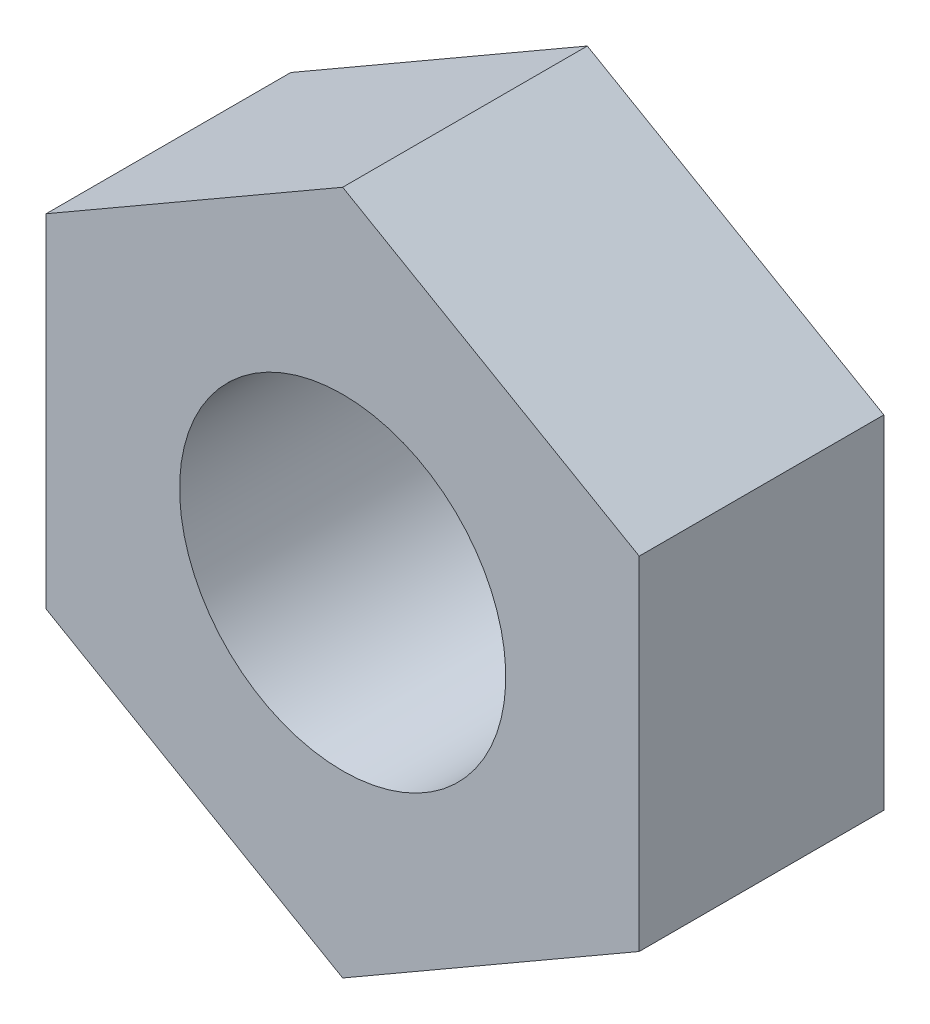
ISO-10303-21;
HEADER;
FILE_DESCRIPTION(('STEP AP214'),'2;1');
FILE_NAME('part.step','',(''),(''),'','','');
FILE_SCHEMA(('AUTOMOTIVE_DESIGN { 1 0 10303 214 1 1 1 1 }'));
ENDSEC;
DATA;
#1=APPLICATION_CONTEXT('core data for automotive mechanical design processes');
#2=APPLICATION_PROTOCOL_DEFINITION('international standard','automotive_design',2000,#1);
#3=PRODUCT_CONTEXT('',#1,'mechanical');
#4=PRODUCT('Part','Part','',(#3));
#5=PRODUCT_RELATED_PRODUCT_CATEGORY('part','',(#4));
#6=PRODUCT_DEFINITION_FORMATION('','',#4);
#7=PRODUCT_DEFINITION_CONTEXT('part definition',#1,'design');
#8=PRODUCT_DEFINITION('design','',#6,#7);
#9=PRODUCT_DEFINITION_SHAPE('','',#8);
#10=(LENGTH_UNIT() NAMED_UNIT(*) SI_UNIT(.MILLI.,.METRE.));
#11=(NAMED_UNIT(*) PLANE_ANGLE_UNIT() SI_UNIT($,.RADIAN.));
#12=(NAMED_UNIT(*) SI_UNIT($,.STERADIAN.) SOLID_ANGLE_UNIT());
#13=UNCERTAINTY_MEASURE_WITH_UNIT(LENGTH_MEASURE(1.E-05),#10,'distance_accuracy_value','');
#14=(GEOMETRIC_REPRESENTATION_CONTEXT(3) GLOBAL_UNCERTAINTY_ASSIGNED_CONTEXT((#13)) GLOBAL_UNIT_ASSIGNED_CONTEXT((#10,
#11,#12)) REPRESENTATION_CONTEXT('',''));
#15=CARTESIAN_POINT('',(0.,0.,0.));
#16=DIRECTION('',(0.,0.,1.));
#17=DIRECTION('',(1.,0.,0.));
#18=AXIS2_PLACEMENT_3D('',#15,#16,#17);
#19=CARTESIAN_POINT('',(42.295947098363,-44.0038969989796,205.592271057495));
#20=DIRECTION('',(1.,0.,0.));
#21=DIRECTION('',(0.,0.,1.));
#22=AXIS2_PLACEMENT_3D('',#19,#20,#21);
#23=PLANE('',#22);
#24=DIRECTION('',(0.,-1.,0.));
#25=VECTOR('',#24,1.);
#26=CARTESIAN_POINT('',(42.295947098363,-44.0038969989796,202.292271057495));
#27=LINE('',#26,#25);
#28=CARTESIAN_POINT('',(42.295947098363,-44.0038969989796,202.292271057495));
#29=VERTEX_POINT('',#28);
#30=CARTESIAN_POINT('',(42.295947098363,-48.6226991524966,202.292271057495));
#31=VERTEX_POINT('',#30);
#32=EDGE_CURVE('E11',#29,#31,#27,.T.);
#33=ORIENTED_EDGE('',*,*,#32,.T.);
#34=DIRECTION('',(0.,0.,-1.));
#35=VECTOR('',#34,1.);
#36=CARTESIAN_POINT('',(42.295947098363,-48.6226991524966,205.592271057495));
#37=LINE('',#36,#35);
#38=CARTESIAN_POINT('',(42.295947098363,-48.6226991524966,205.592271057495));
#39=VERTEX_POINT('',#38);
#40=EDGE_CURVE('E36',#39,#31,#37,.T.);
#41=ORIENTED_EDGE('',*,*,#40,.F.);
#42=DIRECTION('',(0.,-1.,0.));
#43=VECTOR('',#42,1.);
#44=CARTESIAN_POINT('',(42.295947098363,-44.0038969989796,205.592271057495));
#45=LINE('',#44,#43);
#46=CARTESIAN_POINT('',(42.295947098363,-44.0038969989796,205.592271057495));
#47=VERTEX_POINT('',#46);
#48=EDGE_CURVE('E89',#47,#39,#45,.T.);
#49=ORIENTED_EDGE('',*,*,#48,.F.);
#50=DIRECTION('',(0.,0.,-1.));
#51=VECTOR('',#50,1.);
#52=CARTESIAN_POINT('',(42.295947098363,-44.0038969989796,205.592271057495));
#53=LINE('',#52,#51);
#54=EDGE_CURVE('E27',#47,#29,#53,.T.);
#55=ORIENTED_EDGE('',*,*,#54,.T.);
#56=EDGE_LOOP('',(#33,#41,#49,#55));
#57=FACE_BOUND('',#56,.T.);
#58=ADVANCED_FACE('F17',(#57),#23,.F.);
#59=CARTESIAN_POINT('',(42.295947098363,-48.6226991524966,205.592271057495));
#60=DIRECTION('',(0.5,0.866025403784438,0.));
#61=DIRECTION('',(-0.866025403784438,0.5,0.));
#62=AXIS2_PLACEMENT_3D('',#59,#60,#61);
#63=PLANE('',#62);
#64=DIRECTION('',(0.866025403784439,-0.5,0.));
#65=VECTOR('',#64,1.);
#66=CARTESIAN_POINT('',(42.295947098363,-48.6226991524966,202.292271057495));
#67=LINE('',#66,#65);
#68=CARTESIAN_POINT('',(46.295947098363,-50.9321002292552,202.292271057495));
#69=VERTEX_POINT('',#68);
#70=EDGE_CURVE('E100',#31,#69,#67,.T.);
#71=ORIENTED_EDGE('',*,*,#70,.T.);
#72=DIRECTION('',(0.,0.,-1.));
#73=VECTOR('',#72,1.);
#74=CARTESIAN_POINT('',(46.295947098363,-50.9321002292552,205.592271057495));
#75=LINE('',#74,#73);
#76=CARTESIAN_POINT('',(46.295947098363,-50.9321002292552,205.592271057495));
#77=VERTEX_POINT('',#76);
#78=EDGE_CURVE('E102',#77,#69,#75,.T.);
#79=ORIENTED_EDGE('',*,*,#78,.F.);
#80=DIRECTION('',(0.866025403784439,-0.5,0.));
#81=VECTOR('',#80,1.);
#82=CARTESIAN_POINT('',(42.295947098363,-48.6226991524966,205.592271057495));
#83=LINE('',#82,#81);
#84=EDGE_CURVE('E92',#39,#77,#83,.T.);
#85=ORIENTED_EDGE('',*,*,#84,.F.);
#86=ORIENTED_EDGE('',*,*,#40,.T.);
#87=EDGE_LOOP('',(#71,#79,#85,#86));
#88=FACE_BOUND('',#87,.T.);
#89=ADVANCED_FACE('F135',(#88),#63,.F.);
#90=CARTESIAN_POINT('',(46.295947098363,-50.9321002292552,205.592271057495));
#91=DIRECTION('',(-0.5,0.866025403784439,0.));
#92=DIRECTION('',(-0.866025403784439,-0.5,0.));
#93=AXIS2_PLACEMENT_3D('',#90,#91,#92);
#94=PLANE('',#93);
#95=DIRECTION('',(0.866025403784439,0.5,0.));
#96=VECTOR('',#95,1.);
#97=CARTESIAN_POINT('',(46.295947098363,-50.9321002292552,202.292271057495));
#98=LINE('',#97,#96);
#99=CARTESIAN_POINT('',(50.295947098363,-48.6226991524967,202.292271057495));
#100=VERTEX_POINT('',#99);
#101=EDGE_CURVE('E103',#69,#100,#98,.T.);
#102=ORIENTED_EDGE('',*,*,#101,.T.);
#103=DIRECTION('',(0.,0.,-1.));
#104=VECTOR('',#103,1.);
#105=CARTESIAN_POINT('',(50.295947098363,-48.6226991524967,205.592271057495));
#106=LINE('',#105,#104);
#107=CARTESIAN_POINT('',(50.295947098363,-48.6226991524967,205.592271057495));
#108=VERTEX_POINT('',#107);
#109=EDGE_CURVE('E108',#108,#100,#106,.T.);
#110=ORIENTED_EDGE('',*,*,#109,.F.);
#111=DIRECTION('',(0.866025403784439,0.5,0.));
#112=VECTOR('',#111,1.);
#113=CARTESIAN_POINT('',(46.295947098363,-50.9321002292552,205.592271057495));
#114=LINE('',#113,#112);
#115=EDGE_CURVE('E94',#77,#108,#114,.T.);
#116=ORIENTED_EDGE('',*,*,#115,.F.);
#117=ORIENTED_EDGE('',*,*,#78,.T.);
#118=EDGE_LOOP('',(#102,#110,#116,#117));
#119=FACE_BOUND('',#118,.T.);
#120=ADVANCED_FACE('F141',(#119),#94,.F.);
#121=CARTESIAN_POINT('',(50.295947098363,-48.6226991524967,205.592271057495));
#122=DIRECTION('',(-1.,0.,0.));
#123=DIRECTION('',(0.,0.,-1.));
#124=AXIS2_PLACEMENT_3D('',#121,#122,#123);
#125=PLANE('',#124);
#126=DIRECTION('',(0.,1.,0.));
#127=VECTOR('',#126,1.);
#128=CARTESIAN_POINT('',(50.295947098363,-48.6226991524967,202.292271057495));
#129=LINE('',#128,#127);
#130=CARTESIAN_POINT('',(50.295947098363,-44.0038969989796,202.292271057495));
#131=VERTEX_POINT('',#130);
#132=EDGE_CURVE('E104',#100,#131,#129,.T.);
#133=ORIENTED_EDGE('',*,*,#132,.T.);
#134=DIRECTION('',(0.,0.,-1.));
#135=VECTOR('',#134,1.);
#136=CARTESIAN_POINT('',(50.295947098363,-44.0038969989796,205.592271057495));
#137=LINE('',#136,#135);
#138=CARTESIAN_POINT('',(50.295947098363,-44.0038969989796,205.592271057495));
#139=VERTEX_POINT('',#138);
#140=EDGE_CURVE('E114',#139,#131,#137,.T.);
#141=ORIENTED_EDGE('',*,*,#140,.F.);
#142=DIRECTION('',(0.,1.,0.));
#143=VECTOR('',#142,1.);
#144=CARTESIAN_POINT('',(50.295947098363,-48.6226991524967,205.592271057495));
#145=LINE('',#144,#143);
#146=EDGE_CURVE('E84',#108,#139,#145,.T.);
#147=ORIENTED_EDGE('',*,*,#146,.F.);
#148=ORIENTED_EDGE('',*,*,#109,.T.);
#149=EDGE_LOOP('',(#133,#141,#147,#148));
#150=FACE_BOUND('',#149,.T.);
#151=ADVANCED_FACE('F144',(#150),#125,.F.);
#152=CARTESIAN_POINT('',(50.295947098363,-44.0038969989796,205.592271057495));
#153=DIRECTION('',(-0.5,-0.866025403784438,0.));
#154=DIRECTION('',(0.866025403784438,-0.5,0.));
#155=AXIS2_PLACEMENT_3D('',#152,#153,#154);
#156=PLANE('',#155);
#157=DIRECTION('',(-0.866025403784437,0.5,0.));
#158=VECTOR('',#157,1.);
#159=CARTESIAN_POINT('',(50.295947098363,-44.0038969989796,202.292271057495));
#160=LINE('',#159,#158);
#161=CARTESIAN_POINT('',(46.295947098363,-41.6944959222212,202.292271057495));
#162=VERTEX_POINT('',#161);
#163=EDGE_CURVE('E110',#131,#162,#160,.T.);
#164=ORIENTED_EDGE('',*,*,#163,.T.);
#165=DIRECTION('',(0.,0.,-1.));
#166=VECTOR('',#165,1.);
#167=CARTESIAN_POINT('',(46.295947098363,-41.6944959222212,205.592271057495));
#168=LINE('',#167,#166);
#169=CARTESIAN_POINT('',(46.295947098363,-41.6944959222212,205.592271057495));
#170=VERTEX_POINT('',#169);
#171=EDGE_CURVE('E88',#170,#162,#168,.T.);
#172=ORIENTED_EDGE('',*,*,#171,.F.);
#173=DIRECTION('',(-0.866025403784437,0.5,0.));
#174=VECTOR('',#173,1.);
#175=CARTESIAN_POINT('',(50.295947098363,-44.0038969989796,205.592271057495));
#176=LINE('',#175,#174);
#177=EDGE_CURVE('E80',#139,#170,#176,.T.);
#178=ORIENTED_EDGE('',*,*,#177,.F.);
#179=ORIENTED_EDGE('',*,*,#140,.T.);
#180=EDGE_LOOP('',(#164,#172,#178,#179));
#181=FACE_BOUND('',#180,.T.);
#182=ADVANCED_FACE('F122',(#181),#156,.F.);
#183=CARTESIAN_POINT('',(46.295947098363,-41.6944959222212,205.592271057495));
#184=DIRECTION('',(0.5,-0.866025403784439,0.));
#185=DIRECTION('',(0.866025403784439,0.5,0.));
#186=AXIS2_PLACEMENT_3D('',#183,#184,#185);
#187=PLANE('',#186);
#188=DIRECTION('',(-0.866025403784439,-0.5,0.));
#189=VECTOR('',#188,1.);
#190=CARTESIAN_POINT('',(46.295947098363,-41.6944959222212,202.292271057495));
#191=LINE('',#190,#189);
#192=EDGE_CURVE('E87',#162,#29,#191,.T.);
#193=ORIENTED_EDGE('',*,*,#192,.T.);
#194=ORIENTED_EDGE('',*,*,#54,.F.);
#195=DIRECTION('',(-0.866025403784439,-0.5,0.));
#196=VECTOR('',#195,1.);
#197=CARTESIAN_POINT('',(46.295947098363,-41.6944959222212,205.592271057495));
#198=LINE('',#197,#196);
#199=EDGE_CURVE('E78',#170,#47,#198,.T.);
#200=ORIENTED_EDGE('',*,*,#199,.F.);
#201=ORIENTED_EDGE('',*,*,#171,.T.);
#202=EDGE_LOOP('',(#193,#194,#200,#201));
#203=FACE_BOUND('',#202,.T.);
#204=ADVANCED_FACE('F132',(#203),#187,.F.);
#205=CARTESIAN_POINT('',(46.295947098363,-46.3132980757381,205.592271057495));
#206=DIRECTION('',(0.,0.,-1.));
#207=DIRECTION('',(0.,1.,0.));
#208=AXIS2_PLACEMENT_3D('',#205,#206,#207);
#209=CYLINDRICAL_SURFACE('',#208,2.2);
#210=CARTESIAN_POINT('',(46.295947098363,-46.3132980757381,205.592271057495));
#211=DIRECTION('',(0.,0.,1.));
#212=DIRECTION('',(0.,-1.,0.));
#213=AXIS2_PLACEMENT_3D('',#210,#211,#212);
#214=CIRCLE('',#213,2.2);
#215=CARTESIAN_POINT('',(46.295947098363,-48.5132980757381,205.592271057495));
#216=VERTEX_POINT('',#215);
#217=EDGE_CURVE('E72',#216,#216,#214,.T.);
#218=ORIENTED_EDGE('',*,*,#217,.T.);
#219=EDGE_LOOP('',(#218));
#220=FACE_BOUND('',#219,.T.);
#221=CARTESIAN_POINT('',(46.295947098363,-46.3132980757381,202.292271057495));
#222=DIRECTION('',(0.,0.,1.));
#223=DIRECTION('',(0.,-1.,0.));
#224=AXIS2_PLACEMENT_3D('',#221,#222,#223);
#225=CIRCLE('',#224,2.2);
#226=CARTESIAN_POINT('',(46.295947098363,-48.5132980757381,202.292271057495));
#227=VERTEX_POINT('',#226);
#228=EDGE_CURVE('E21',#227,#227,#225,.T.);
#229=ORIENTED_EDGE('',*,*,#228,.F.);
#230=EDGE_LOOP('',(#229));
#231=FACE_BOUND('',#230,.T.);
#232=ADVANCED_FACE('F76',(#220,#231),#209,.F.);
#233=CARTESIAN_POINT('',(46.295947098363,-46.3132980757381,205.592271057495));
#234=DIRECTION('',(0.,0.,1.));
#235=DIRECTION('',(0.,-1.,0.));
#236=AXIS2_PLACEMENT_3D('',#233,#234,#235);
#237=PLANE('',#236);
#238=ORIENTED_EDGE('',*,*,#48,.T.);
#239=ORIENTED_EDGE('',*,*,#84,.T.);
#240=ORIENTED_EDGE('',*,*,#115,.T.);
#241=ORIENTED_EDGE('',*,*,#146,.T.);
#242=ORIENTED_EDGE('',*,*,#177,.T.);
#243=ORIENTED_EDGE('',*,*,#199,.T.);
#244=EDGE_LOOP('',(#238,#239,#240,#241,#242,#243));
#245=FACE_BOUND('',#244,.T.);
#246=ORIENTED_EDGE('',*,*,#217,.F.);
#247=EDGE_LOOP('',(#246));
#248=FACE_BOUND('',#247,.T.);
#249=ADVANCED_FACE('F137',(#245,#248),#237,.T.);
#250=CARTESIAN_POINT('',(46.295947098363,-46.3132980757381,202.292271057495));
#251=DIRECTION('',(0.,0.,1.));
#252=DIRECTION('',(0.,-1.,0.));
#253=AXIS2_PLACEMENT_3D('',#250,#251,#252);
#254=PLANE('',#253);
#255=ORIENTED_EDGE('',*,*,#32,.F.);
#256=ORIENTED_EDGE('',*,*,#192,.F.);
#257=ORIENTED_EDGE('',*,*,#163,.F.);
#258=ORIENTED_EDGE('',*,*,#132,.F.);
#259=ORIENTED_EDGE('',*,*,#101,.F.);
#260=ORIENTED_EDGE('',*,*,#70,.F.);
#261=EDGE_LOOP('',(#255,#256,#257,#258,#259,#260));
#262=FACE_BOUND('',#261,.T.);
#263=ORIENTED_EDGE('',*,*,#228,.T.);
#264=EDGE_LOOP('',(#263));
#265=FACE_BOUND('',#264,.T.);
#266=ADVANCED_FACE('F19',(#262,#265),#254,.F.);
#267=CLOSED_SHELL('',(#58,#89,#120,#151,#182,#204,#232,#249,#266));
#268=MANIFOLD_SOLID_BREP('B1',#267);
#269=ADVANCED_BREP_SHAPE_REPRESENTATION('',(#18,#268),#14);
#270=SHAPE_DEFINITION_REPRESENTATION(#9,#269);
ENDSEC;
END-ISO-10303-21;
